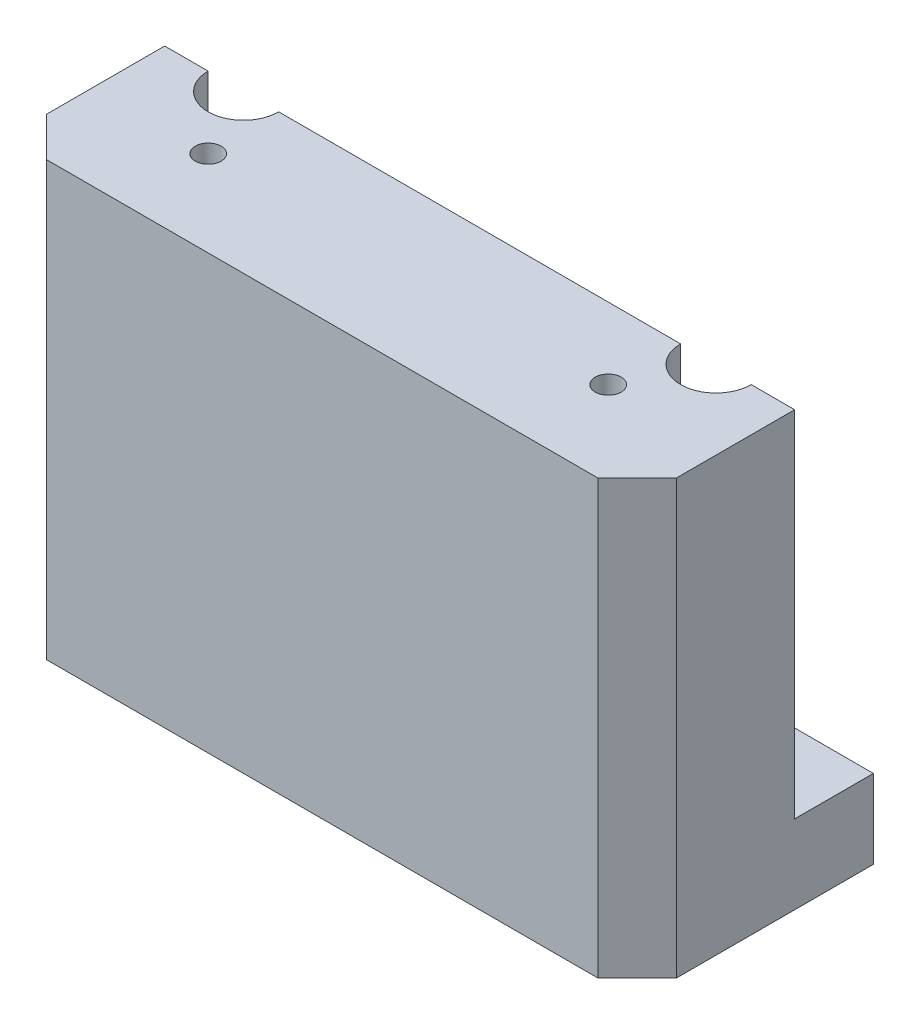
ISO-10303-21;
HEADER;
FILE_DESCRIPTION(('STEP AP214'),'2;1');
FILE_NAME('part.step','',(''),(''),'','','');
FILE_SCHEMA(('AUTOMOTIVE_DESIGN { 1 0 10303 214 1 1 1 1 }'));
ENDSEC;
DATA;
#1=APPLICATION_CONTEXT('core data for automotive mechanical design processes');
#2=APPLICATION_PROTOCOL_DEFINITION('international standard','automotive_design',2000,#1);
#3=PRODUCT_CONTEXT('',#1,'mechanical');
#4=PRODUCT('Part','Part','',(#3));
#5=PRODUCT_RELATED_PRODUCT_CATEGORY('part','',(#4));
#6=PRODUCT_DEFINITION_FORMATION('','',#4);
#7=PRODUCT_DEFINITION_CONTEXT('part definition',#1,'design');
#8=PRODUCT_DEFINITION('design','',#6,#7);
#9=PRODUCT_DEFINITION_SHAPE('','',#8);
#10=(LENGTH_UNIT() NAMED_UNIT(*) SI_UNIT(.MILLI.,.METRE.));
#11=(NAMED_UNIT(*) PLANE_ANGLE_UNIT() SI_UNIT($,.RADIAN.));
#12=(NAMED_UNIT(*) SI_UNIT($,.STERADIAN.) SOLID_ANGLE_UNIT());
#13=UNCERTAINTY_MEASURE_WITH_UNIT(LENGTH_MEASURE(1.E-05),#10,'distance_accuracy_value','');
#14=(GEOMETRIC_REPRESENTATION_CONTEXT(3) GLOBAL_UNCERTAINTY_ASSIGNED_CONTEXT((#13)) GLOBAL_UNIT_ASSIGNED_CONTEXT((#10,
#11,#12)) REPRESENTATION_CONTEXT('',''));
#15=CARTESIAN_POINT('',(0.,0.,0.));
#16=DIRECTION('',(0.,0.,1.));
#17=DIRECTION('',(1.,0.,0.));
#18=AXIS2_PLACEMENT_3D('',#15,#16,#17);
#19=CARTESIAN_POINT('',(0.,55.,0.));
#20=DIRECTION('',(0.,-1.,0.));
#21=DIRECTION('',(0.,0.,-1.));
#22=AXIS2_PLACEMENT_3D('',#19,#20,#21);
#23=PLANE('',#22);
#24=CARTESIAN_POINT('',(25.4,55.,4.078));
#25=DIRECTION('',(0.,1.,0.));
#26=DIRECTION('',(0.,0.,1.));
#27=AXIS2_PLACEMENT_3D('',#24,#25,#26);
#28=CIRCLE('',#27,1.64999999999999);
#29=CARTESIAN_POINT('',(25.4,55.,5.72799999999999));
#30=VERTEX_POINT('',#29);
#31=EDGE_CURVE('E250',#30,#30,#28,.T.);
#32=ORIENTED_EDGE('',*,*,#31,.F.);
#33=EDGE_LOOP('',(#32));
#34=FACE_BOUND('',#33,.T.);
#35=CARTESIAN_POINT('',(-25.4,55.,4.078));
#36=DIRECTION('',(0.,1.,0.));
#37=DIRECTION('',(0.,0.,1.));
#38=AXIS2_PLACEMENT_3D('',#35,#36,#37);
#39=CIRCLE('',#38,1.64999999999999);
#40=CARTESIAN_POINT('',(-25.4,55.,5.72799999999999));
#41=VERTEX_POINT('',#40);
#42=EDGE_CURVE('E316',#41,#41,#39,.T.);
#43=ORIENTED_EDGE('',*,*,#42,.F.);
#44=EDGE_LOOP('',(#43));
#45=FACE_BOUND('',#44,.T.);
#46=DIRECTION('',(-1.,0.,0.));
#47=VECTOR('',#46,1.);
#48=CARTESIAN_POINT('',(40.,55.,-5.));
#49=LINE('',#48,#47);
#50=CARTESIAN_POINT('',(-34.48,55.,-5.));
#51=VERTEX_POINT('',#50);
#52=CARTESIAN_POINT('',(-40.,55.,-5.));
#53=VERTEX_POINT('',#52);
#54=EDGE_CURVE('E147',#51,#53,#49,.T.);
#55=ORIENTED_EDGE('',*,*,#54,.T.);
#56=DIRECTION('',(0.,0.,1.));
#57=VECTOR('',#56,1.);
#58=CARTESIAN_POINT('',(-40.,55.,15.));
#59=LINE('',#58,#57);
#60=CARTESIAN_POINT('',(-40.,55.,9.99999999999997));
#61=VERTEX_POINT('',#60);
#62=EDGE_CURVE('E159',#53,#61,#59,.T.);
#63=ORIENTED_EDGE('',*,*,#62,.T.);
#64=DIRECTION('',(-0.707106781186546,0.,-0.707106781186549));
#65=VECTOR('',#64,1.);
#66=CARTESIAN_POINT('',(-35.,55.,15.));
#67=LINE('',#66,#65);
#68=CARTESIAN_POINT('',(-35.,55.,15.));
#69=VERTEX_POINT('',#68);
#70=EDGE_CURVE('E222',#61,#69,#67,.F.);
#71=ORIENTED_EDGE('',*,*,#70,.T.);
#72=DIRECTION('',(1.,0.,0.));
#73=VECTOR('',#72,1.);
#74=CARTESIAN_POINT('',(-40.,55.,15.));
#75=LINE('',#74,#73);
#76=CARTESIAN_POINT('',(35.,55.,15.));
#77=VERTEX_POINT('',#76);
#78=EDGE_CURVE('E174',#69,#77,#75,.T.);
#79=ORIENTED_EDGE('',*,*,#78,.T.);
#80=DIRECTION('',(-0.707106781186549,0.,0.707106781186547));
#81=VECTOR('',#80,1.);
#82=CARTESIAN_POINT('',(40.,55.,10.));
#83=LINE('',#82,#81);
#84=CARTESIAN_POINT('',(40.,55.,10.));
#85=VERTEX_POINT('',#84);
#86=EDGE_CURVE('E72',#77,#85,#83,.F.);
#87=ORIENTED_EDGE('',*,*,#86,.T.);
#88=DIRECTION('',(0.,0.,-1.));
#89=VECTOR('',#88,1.);
#90=CARTESIAN_POINT('',(40.,55.,15.));
#91=LINE('',#90,#89);
#92=CARTESIAN_POINT('',(40.,55.,-5.));
#93=VERTEX_POINT('',#92);
#94=EDGE_CURVE('E175',#85,#93,#91,.T.);
#95=ORIENTED_EDGE('',*,*,#94,.T.);
#96=CARTESIAN_POINT('',(34.48,55.,-5.));
#97=VERTEX_POINT('',#96);
#98=EDGE_CURVE('E156',#93,#97,#49,.T.);
#99=ORIENTED_EDGE('',*,*,#98,.T.);
#100=CARTESIAN_POINT('',(30.,55.,-5.));
#101=DIRECTION('',(0.,1.,0.));
#102=DIRECTION('',(0.,0.,1.));
#103=AXIS2_PLACEMENT_3D('',#100,#101,#102);
#104=CIRCLE('',#103,4.48);
#105=CARTESIAN_POINT('',(25.52,55.,-5.));
#106=VERTEX_POINT('',#105);
#107=EDGE_CURVE('E238',#106,#97,#104,.T.);
#108=ORIENTED_EDGE('',*,*,#107,.F.);
#109=CARTESIAN_POINT('',(-25.52,55.,-5.));
#110=VERTEX_POINT('',#109);
#111=EDGE_CURVE('E165',#106,#110,#49,.T.);
#112=ORIENTED_EDGE('',*,*,#111,.T.);
#113=CARTESIAN_POINT('',(-30.,55.,-5.));
#114=DIRECTION('',(0.,1.,0.));
#115=DIRECTION('',(0.,0.,1.));
#116=AXIS2_PLACEMENT_3D('',#113,#114,#115);
#117=CIRCLE('',#116,4.48);
#118=EDGE_CURVE('E163',#51,#110,#117,.T.);
#119=ORIENTED_EDGE('',*,*,#118,.F.);
#120=EDGE_LOOP('',(#55,#63,#71,#79,#87,#95,#99,#108,#112,#119));
#121=FACE_BOUND('',#120,.T.);
#122=ADVANCED_FACE('F47',(#34,#45,#121),#23,.F.);
#123=CARTESIAN_POINT('',(30.,55.,-5.));
#124=DIRECTION('',(0.,1.,0.));
#125=DIRECTION('',(0.,0.,1.));
#126=AXIS2_PLACEMENT_3D('',#123,#124,#125);
#127=CYLINDRICAL_SURFACE('',#126,4.47999999999999);
#128=DIRECTION('',(0.,1.,0.));
#129=VECTOR('',#128,1.);
#130=CARTESIAN_POINT('',(25.52,55.,-5.));
#131=LINE('',#130,#129);
#132=CARTESIAN_POINT('',(25.52,10.,-5.));
#133=VERTEX_POINT('',#132);
#134=EDGE_CURVE('E311',#106,#133,#131,.F.);
#135=ORIENTED_EDGE('',*,*,#134,.F.);
#136=ORIENTED_EDGE('',*,*,#107,.T.);
#137=DIRECTION('',(0.,1.,0.));
#138=VECTOR('',#137,1.);
#139=CARTESIAN_POINT('',(34.48,55.,-5.));
#140=LINE('',#139,#138);
#141=CARTESIAN_POINT('',(34.48,10.,-5.));
#142=VERTEX_POINT('',#141);
#143=EDGE_CURVE('E303',#142,#97,#140,.T.);
#144=ORIENTED_EDGE('',*,*,#143,.F.);
#145=CARTESIAN_POINT('',(30.,10.,-5.));
#146=DIRECTION('',(0.,1.,0.));
#147=DIRECTION('',(0.,0.,1.));
#148=AXIS2_PLACEMENT_3D('',#145,#146,#147);
#149=CIRCLE('',#148,4.47999999999999);
#150=EDGE_CURVE('E266',#133,#142,#149,.T.);
#151=ORIENTED_EDGE('',*,*,#150,.F.);
#152=EDGE_LOOP('',(#135,#136,#144,#151));
#153=FACE_BOUND('',#152,.T.);
#154=ADVANCED_FACE('F309',(#153),#127,.F.);
#155=CARTESIAN_POINT('',(-30.,55.,-5.));
#156=DIRECTION('',(0.,1.,0.));
#157=DIRECTION('',(0.,0.,1.));
#158=AXIS2_PLACEMENT_3D('',#155,#156,#157);
#159=CYLINDRICAL_SURFACE('',#158,4.47999999999999);
#160=DIRECTION('',(0.,1.,0.));
#161=VECTOR('',#160,1.);
#162=CARTESIAN_POINT('',(-34.48,55.,-5.));
#163=LINE('',#162,#161);
#164=CARTESIAN_POINT('',(-34.48,10.,-5.));
#165=VERTEX_POINT('',#164);
#166=EDGE_CURVE('E11',#51,#165,#163,.F.);
#167=ORIENTED_EDGE('',*,*,#166,.F.);
#168=ORIENTED_EDGE('',*,*,#118,.T.);
#169=DIRECTION('',(0.,1.,0.));
#170=VECTOR('',#169,1.);
#171=CARTESIAN_POINT('',(-25.52,55.,-5.));
#172=LINE('',#171,#170);
#173=CARTESIAN_POINT('',(-25.52,10.,-5.));
#174=VERTEX_POINT('',#173);
#175=EDGE_CURVE('E57',#174,#110,#172,.T.);
#176=ORIENTED_EDGE('',*,*,#175,.F.);
#177=CARTESIAN_POINT('',(-30.,10.,-5.));
#178=DIRECTION('',(0.,1.,0.));
#179=DIRECTION('',(0.,0.,1.));
#180=AXIS2_PLACEMENT_3D('',#177,#178,#179);
#181=CIRCLE('',#180,4.47999999999999);
#182=EDGE_CURVE('E242',#165,#174,#181,.T.);
#183=ORIENTED_EDGE('',*,*,#182,.F.);
#184=EDGE_LOOP('',(#167,#168,#176,#183));
#185=FACE_BOUND('',#184,.T.);
#186=ADVANCED_FACE('F240',(#185),#159,.F.);
#187=CARTESIAN_POINT('',(40.,55.,15.));
#188=DIRECTION('',(-1.,0.,0.));
#189=DIRECTION('',(0.,0.,1.));
#190=AXIS2_PLACEMENT_3D('',#187,#188,#189);
#191=PLANE('',#190);
#192=DIRECTION('',(0.,-1.,0.));
#193=VECTOR('',#192,1.);
#194=CARTESIAN_POINT('',(40.,55.,-15.));
#195=LINE('',#194,#193);
#196=CARTESIAN_POINT('',(40.,10.,-15.));
#197=VERTEX_POINT('',#196);
#198=CARTESIAN_POINT('',(40.,0.,-15.));
#199=VERTEX_POINT('',#198);
#200=EDGE_CURVE('E202',#197,#199,#195,.T.);
#201=ORIENTED_EDGE('',*,*,#200,.F.);
#202=DIRECTION('',(0.,0.,-1.));
#203=VECTOR('',#202,1.);
#204=CARTESIAN_POINT('',(40.,10.,-5.));
#205=LINE('',#204,#203);
#206=CARTESIAN_POINT('',(40.,10.,-5.));
#207=VERTEX_POINT('',#206);
#208=EDGE_CURVE('E318',#207,#197,#205,.T.);
#209=ORIENTED_EDGE('',*,*,#208,.F.);
#210=DIRECTION('',(0.,1.,0.));
#211=VECTOR('',#210,1.);
#212=CARTESIAN_POINT('',(40.,10.,-5.));
#213=LINE('',#212,#211);
#214=EDGE_CURVE('E305',#207,#93,#213,.T.);
#215=ORIENTED_EDGE('',*,*,#214,.T.);
#216=ORIENTED_EDGE('',*,*,#94,.F.);
#217=DIRECTION('',(0.,-1.,0.));
#218=VECTOR('',#217,1.);
#219=CARTESIAN_POINT('',(40.,55.,10.));
#220=LINE('',#219,#218);
#221=CARTESIAN_POINT('',(40.,0.,10.));
#222=VERTEX_POINT('',#221);
#223=EDGE_CURVE('E225',#85,#222,#220,.T.);
#224=ORIENTED_EDGE('',*,*,#223,.T.);
#225=DIRECTION('',(0.,0.,-1.));
#226=VECTOR('',#225,1.);
#227=CARTESIAN_POINT('',(40.,0.,15.));
#228=LINE('',#227,#226);
#229=EDGE_CURVE('E185',#222,#199,#228,.T.);
#230=ORIENTED_EDGE('',*,*,#229,.T.);
#231=EDGE_LOOP('',(#201,#209,#215,#216,#224,#230));
#232=FACE_BOUND('',#231,.T.);
#233=ADVANCED_FACE('F366',(#232),#191,.F.);
#234=CARTESIAN_POINT('',(-40.,55.,-15.));
#235=DIRECTION('',(0.,0.,1.));
#236=DIRECTION('',(1.,0.,0.));
#237=AXIS2_PLACEMENT_3D('',#234,#235,#236);
#238=PLANE('',#237);
#239=DIRECTION('',(0.,-1.,0.));
#240=VECTOR('',#239,1.);
#241=CARTESIAN_POINT('',(-40.,55.,-15.));
#242=LINE('',#241,#240);
#243=CARTESIAN_POINT('',(-40.,10.,-15.));
#244=VERTEX_POINT('',#243);
#245=CARTESIAN_POINT('',(-40.,0.,-15.));
#246=VERTEX_POINT('',#245);
#247=EDGE_CURVE('E179',#244,#246,#242,.T.);
#248=ORIENTED_EDGE('',*,*,#247,.F.);
#249=DIRECTION('',(-1.,0.,0.));
#250=VECTOR('',#249,1.);
#251=CARTESIAN_POINT('',(40.,10.,-15.));
#252=LINE('',#251,#250);
#253=EDGE_CURVE('E166',#197,#244,#252,.T.);
#254=ORIENTED_EDGE('',*,*,#253,.F.);
#255=ORIENTED_EDGE('',*,*,#200,.T.);
#256=DIRECTION('',(-1.,0.,0.));
#257=VECTOR('',#256,1.);
#258=CARTESIAN_POINT('',(-40.,0.,-15.));
#259=LINE('',#258,#257);
#260=EDGE_CURVE('E189',#199,#246,#259,.T.);
#261=ORIENTED_EDGE('',*,*,#260,.T.);
#262=EDGE_LOOP('',(#248,#254,#255,#261));
#263=FACE_BOUND('',#262,.T.);
#264=ADVANCED_FACE('F384',(#263),#238,.F.);
#265=CARTESIAN_POINT('',(-40.,55.,15.));
#266=DIRECTION('',(1.,0.,0.));
#267=DIRECTION('',(0.,0.,-1.));
#268=AXIS2_PLACEMENT_3D('',#265,#266,#267);
#269=PLANE('',#268);
#270=DIRECTION('',(0.,1.,0.));
#271=VECTOR('',#270,1.);
#272=CARTESIAN_POINT('',(-40.,10.,-5.));
#273=LINE('',#272,#271);
#274=CARTESIAN_POINT('',(-40.,10.,-5.));
#275=VERTEX_POINT('',#274);
#276=EDGE_CURVE('E144',#275,#53,#273,.T.);
#277=ORIENTED_EDGE('',*,*,#276,.F.);
#278=DIRECTION('',(0.,0.,-1.));
#279=VECTOR('',#278,1.);
#280=CARTESIAN_POINT('',(-40.,10.,-5.));
#281=LINE('',#280,#279);
#282=EDGE_CURVE('E312',#275,#244,#281,.T.);
#283=ORIENTED_EDGE('',*,*,#282,.T.);
#284=ORIENTED_EDGE('',*,*,#247,.T.);
#285=DIRECTION('',(0.,0.,1.));
#286=VECTOR('',#285,1.);
#287=CARTESIAN_POINT('',(-40.,0.,15.));
#288=LINE('',#287,#286);
#289=CARTESIAN_POINT('',(-40.,0.,9.99999999999997));
#290=VERTEX_POINT('',#289);
#291=EDGE_CURVE('E194',#246,#290,#288,.T.);
#292=ORIENTED_EDGE('',*,*,#291,.T.);
#293=DIRECTION('',(0.,1.,0.));
#294=VECTOR('',#293,1.);
#295=CARTESIAN_POINT('',(-40.,55.,9.99999999999997));
#296=LINE('',#295,#294);
#297=EDGE_CURVE('E171',#290,#61,#296,.T.);
#298=ORIENTED_EDGE('',*,*,#297,.T.);
#299=ORIENTED_EDGE('',*,*,#62,.F.);
#300=EDGE_LOOP('',(#277,#283,#284,#292,#298,#299));
#301=FACE_BOUND('',#300,.T.);
#302=ADVANCED_FACE('F168',(#301),#269,.F.);
#303=CARTESIAN_POINT('',(-40.,55.,15.));
#304=DIRECTION('',(0.,0.,-1.));
#305=DIRECTION('',(-1.,0.,0.));
#306=AXIS2_PLACEMENT_3D('',#303,#304,#305);
#307=PLANE('',#306);
#308=ORIENTED_EDGE('',*,*,#78,.F.);
#309=DIRECTION('',(0.,-1.,0.));
#310=VECTOR('',#309,1.);
#311=CARTESIAN_POINT('',(-35.,55.,15.));
#312=LINE('',#311,#310);
#313=CARTESIAN_POINT('',(-35.,0.,15.));
#314=VERTEX_POINT('',#313);
#315=EDGE_CURVE('E208',#69,#314,#312,.T.);
#316=ORIENTED_EDGE('',*,*,#315,.T.);
#317=DIRECTION('',(1.,0.,0.));
#318=VECTOR('',#317,1.);
#319=CARTESIAN_POINT('',(-40.,0.,15.));
#320=LINE('',#319,#318);
#321=CARTESIAN_POINT('',(35.,0.,15.));
#322=VERTEX_POINT('',#321);
#323=EDGE_CURVE('E181',#314,#322,#320,.T.);
#324=ORIENTED_EDGE('',*,*,#323,.T.);
#325=DIRECTION('',(0.,1.,0.));
#326=VECTOR('',#325,1.);
#327=CARTESIAN_POINT('',(35.,55.,15.));
#328=LINE('',#327,#326);
#329=EDGE_CURVE('E205',#322,#77,#328,.T.);
#330=ORIENTED_EDGE('',*,*,#329,.T.);
#331=EDGE_LOOP('',(#308,#316,#324,#330));
#332=FACE_BOUND('',#331,.T.);
#333=ADVANCED_FACE('F377',(#332),#307,.F.);
#334=CARTESIAN_POINT('',(0.,0.,0.));
#335=DIRECTION('',(0.,-1.,0.));
#336=DIRECTION('',(0.,0.,-1.));
#337=AXIS2_PLACEMENT_3D('',#334,#335,#336);
#338=PLANE('',#337);
#339=CARTESIAN_POINT('',(-30.,0.,-5.));
#340=DIRECTION('',(0.,1.,0.));
#341=DIRECTION('',(0.,0.,1.));
#342=AXIS2_PLACEMENT_3D('',#339,#340,#341);
#343=CIRCLE('',#342,2.24999999999998);
#344=CARTESIAN_POINT('',(-30.,0.,-2.75000000000001));
#345=VERTEX_POINT('',#344);
#346=EDGE_CURVE('E260',#345,#345,#343,.T.);
#347=ORIENTED_EDGE('',*,*,#346,.T.);
#348=EDGE_LOOP('',(#347));
#349=FACE_BOUND('',#348,.T.);
#350=CARTESIAN_POINT('',(30.,0.,-5.));
#351=DIRECTION('',(0.,1.,0.));
#352=DIRECTION('',(0.,0.,1.));
#353=AXIS2_PLACEMENT_3D('',#350,#351,#352);
#354=CIRCLE('',#353,2.24999999999999);
#355=CARTESIAN_POINT('',(30.,0.,-2.75000000000001));
#356=VERTEX_POINT('',#355);
#357=EDGE_CURVE('E190',#356,#356,#354,.T.);
#358=ORIENTED_EDGE('',*,*,#357,.T.);
#359=EDGE_LOOP('',(#358));
#360=FACE_BOUND('',#359,.T.);
#361=ORIENTED_EDGE('',*,*,#323,.F.);
#362=DIRECTION('',(0.707106781186546,0.,0.707106781186549));
#363=VECTOR('',#362,1.);
#364=CARTESIAN_POINT('',(-25.0000000000001,0.,25.));
#365=LINE('',#364,#363);
#366=EDGE_CURVE('E215',#314,#290,#365,.F.);
#367=ORIENTED_EDGE('',*,*,#366,.T.);
#368=ORIENTED_EDGE('',*,*,#291,.F.);
#369=ORIENTED_EDGE('',*,*,#260,.F.);
#370=ORIENTED_EDGE('',*,*,#229,.F.);
#371=DIRECTION('',(0.707106781186549,0.,-0.707106781186547));
#372=VECTOR('',#371,1.);
#373=CARTESIAN_POINT('',(24.9999999999999,0.,25.));
#374=LINE('',#373,#372);
#375=EDGE_CURVE('E212',#222,#322,#374,.F.);
#376=ORIENTED_EDGE('',*,*,#375,.T.);
#377=EDGE_LOOP('',(#361,#367,#368,#369,#370,#376));
#378=FACE_BOUND('',#377,.T.);
#379=ADVANCED_FACE('F278',(#349,#360,#378),#338,.T.);
#380=CARTESIAN_POINT('',(30.,55.,-5.));
#381=DIRECTION('',(0.,1.,0.));
#382=DIRECTION('',(0.,0.,1.));
#383=AXIS2_PLACEMENT_3D('',#380,#381,#382);
#384=CYLINDRICAL_SURFACE('',#383,2.24999999999999);
#385=ORIENTED_EDGE('',*,*,#357,.F.);
#386=EDGE_LOOP('',(#385));
#387=FACE_BOUND('',#386,.T.);
#388=CARTESIAN_POINT('',(30.,7.77000000000001,-5.));
#389=DIRECTION('',(0.,1.,0.));
#390=DIRECTION('',(0.,0.,1.));
#391=AXIS2_PLACEMENT_3D('',#388,#389,#390);
#392=CIRCLE('',#391,2.24999999999999);
#393=CARTESIAN_POINT('',(30.,7.77000000000001,-2.75000000000001));
#394=VERTEX_POINT('',#393);
#395=EDGE_CURVE('E271',#394,#394,#392,.T.);
#396=ORIENTED_EDGE('',*,*,#395,.T.);
#397=EDGE_LOOP('',(#396));
#398=FACE_BOUND('',#397,.T.);
#399=ADVANCED_FACE('F281',(#387,#398),#384,.F.);
#400=CARTESIAN_POINT('',(30.,10.,-5.));
#401=DIRECTION('',(0.,1.,0.));
#402=DIRECTION('',(0.,0.,1.));
#403=AXIS2_PLACEMENT_3D('',#400,#401,#402);
#404=CONICAL_SURFACE('',#403,4.47999999999999,0.78539816339745);
#405=ORIENTED_EDGE('',*,*,#395,.F.);
#406=EDGE_LOOP('',(#405));
#407=FACE_BOUND('',#406,.T.);
#408=EDGE_CURVE('E267',#142,#133,#149,.T.);
#409=ORIENTED_EDGE('',*,*,#408,.T.);
#410=ORIENTED_EDGE('',*,*,#150,.T.);
#411=EDGE_LOOP('',(#409,#410));
#412=FACE_BOUND('',#411,.T.);
#413=ADVANCED_FACE('F284',(#407,#412),#404,.F.);
#414=CARTESIAN_POINT('',(-30.,55.,-5.));
#415=DIRECTION('',(0.,1.,0.));
#416=DIRECTION('',(0.,0.,1.));
#417=AXIS2_PLACEMENT_3D('',#414,#415,#416);
#418=CYLINDRICAL_SURFACE('',#417,2.24999999999999);
#419=ORIENTED_EDGE('',*,*,#346,.F.);
#420=EDGE_LOOP('',(#419));
#421=FACE_BOUND('',#420,.T.);
#422=CARTESIAN_POINT('',(-30.,7.77000000000001,-5.));
#423=DIRECTION('',(0.,1.,0.));
#424=DIRECTION('',(0.,0.,1.));
#425=AXIS2_PLACEMENT_3D('',#422,#423,#424);
#426=CIRCLE('',#425,2.24999999999999);
#427=CARTESIAN_POINT('',(-30.,7.77000000000001,-2.75000000000001));
#428=VERTEX_POINT('',#427);
#429=EDGE_CURVE('E256',#428,#428,#426,.T.);
#430=ORIENTED_EDGE('',*,*,#429,.T.);
#431=EDGE_LOOP('',(#430));
#432=FACE_BOUND('',#431,.T.);
#433=ADVANCED_FACE('F290',(#421,#432),#418,.F.);
#434=CARTESIAN_POINT('',(-30.,10.,-5.));
#435=DIRECTION('',(0.,1.,0.));
#436=DIRECTION('',(0.,0.,1.));
#437=AXIS2_PLACEMENT_3D('',#434,#435,#436);
#438=CONICAL_SURFACE('',#437,4.47999999999999,0.78539816339745);
#439=ORIENTED_EDGE('',*,*,#429,.F.);
#440=EDGE_LOOP('',(#439));
#441=FACE_BOUND('',#440,.T.);
#442=EDGE_CURVE('E247',#174,#165,#181,.T.);
#443=ORIENTED_EDGE('',*,*,#442,.T.);
#444=ORIENTED_EDGE('',*,*,#182,.T.);
#445=EDGE_LOOP('',(#443,#444));
#446=FACE_BOUND('',#445,.T.);
#447=ADVANCED_FACE('F362',(#441,#446),#438,.F.);
#448=CARTESIAN_POINT('',(25.4,35.,4.078));
#449=DIRECTION('',(0.,1.,0.));
#450=DIRECTION('',(0.,0.,1.));
#451=AXIS2_PLACEMENT_3D('',#448,#449,#450);
#452=CONICAL_SURFACE('',#451,1.65,1.02974425867665);
#453=CARTESIAN_POINT('',(25.4,34.0085799786045,4.078));
#454=VERTEX_POINT('',#453);
#455=VERTEX_LOOP('',#454);
#456=FACE_BOUND('',#455,.T.);
#457=CARTESIAN_POINT('',(25.4,35.,4.078));
#458=DIRECTION('',(0.,1.,0.));
#459=DIRECTION('',(0.,0.,1.));
#460=AXIS2_PLACEMENT_3D('',#457,#458,#459);
#461=CIRCLE('',#460,1.65);
#462=CARTESIAN_POINT('',(25.4,35.,5.728));
#463=VERTEX_POINT('',#462);
#464=EDGE_CURVE('E243',#463,#463,#461,.T.);
#465=ORIENTED_EDGE('',*,*,#464,.T.);
#466=EDGE_LOOP('',(#465));
#467=FACE_BOUND('',#466,.T.);
#468=ADVANCED_FACE('F358',(#456,#467),#452,.F.);
#469=CARTESIAN_POINT('',(25.4,55.,4.078));
#470=DIRECTION('',(0.,1.,0.));
#471=DIRECTION('',(0.,0.,1.));
#472=AXIS2_PLACEMENT_3D('',#469,#470,#471);
#473=CYLINDRICAL_SURFACE('',#472,1.64999999999999);
#474=ORIENTED_EDGE('',*,*,#464,.F.);
#475=EDGE_LOOP('',(#474));
#476=FACE_BOUND('',#475,.T.);
#477=ORIENTED_EDGE('',*,*,#31,.T.);
#478=EDGE_LOOP('',(#477));
#479=FACE_BOUND('',#478,.T.);
#480=ADVANCED_FACE('F332',(#476,#479),#473,.F.);
#481=CARTESIAN_POINT('',(-25.4,35.,4.078));
#482=DIRECTION('',(0.,1.,0.));
#483=DIRECTION('',(0.,0.,1.));
#484=AXIS2_PLACEMENT_3D('',#481,#482,#483);
#485=CONICAL_SURFACE('',#484,1.65,1.02974425867665);
#486=CARTESIAN_POINT('',(-25.4,34.0085799786045,4.078));
#487=VERTEX_POINT('',#486);
#488=VERTEX_LOOP('',#487);
#489=FACE_BOUND('',#488,.T.);
#490=CARTESIAN_POINT('',(-25.4,35.,4.078));
#491=DIRECTION('',(0.,1.,0.));
#492=DIRECTION('',(0.,0.,1.));
#493=AXIS2_PLACEMENT_3D('',#490,#491,#492);
#494=CIRCLE('',#493,1.65);
#495=CARTESIAN_POINT('',(-25.4,35.,5.728));
#496=VERTEX_POINT('',#495);
#497=EDGE_CURVE('E325',#496,#496,#494,.T.);
#498=ORIENTED_EDGE('',*,*,#497,.T.);
#499=EDGE_LOOP('',(#498));
#500=FACE_BOUND('',#499,.T.);
#501=ADVANCED_FACE('F342',(#489,#500),#485,.F.);
#502=CARTESIAN_POINT('',(-25.4,55.,4.078));
#503=DIRECTION('',(0.,1.,0.));
#504=DIRECTION('',(0.,0.,1.));
#505=AXIS2_PLACEMENT_3D('',#502,#503,#504);
#506=CYLINDRICAL_SURFACE('',#505,1.64999999999999);
#507=ORIENTED_EDGE('',*,*,#497,.F.);
#508=EDGE_LOOP('',(#507));
#509=FACE_BOUND('',#508,.T.);
#510=ORIENTED_EDGE('',*,*,#42,.T.);
#511=EDGE_LOOP('',(#510));
#512=FACE_BOUND('',#511,.T.);
#513=ADVANCED_FACE('F339',(#509,#512),#506,.F.);
#514=CARTESIAN_POINT('',(-35.,55.,15.));
#515=DIRECTION('',(0.707106781186549,0.,-0.707106781186545));
#516=DIRECTION('',(0.,-1.,0.));
#517=AXIS2_PLACEMENT_3D('',#514,#515,#516);
#518=PLANE('',#517);
#519=ORIENTED_EDGE('',*,*,#70,.F.);
#520=ORIENTED_EDGE('',*,*,#297,.F.);
#521=ORIENTED_EDGE('',*,*,#366,.F.);
#522=ORIENTED_EDGE('',*,*,#315,.F.);
#523=EDGE_LOOP('',(#519,#520,#521,#522));
#524=FACE_BOUND('',#523,.T.);
#525=ADVANCED_FACE('F341',(#524),#518,.F.);
#526=CARTESIAN_POINT('',(40.,55.,10.));
#527=DIRECTION('',(-0.707106781186547,0.,-0.707106781186549));
#528=DIRECTION('',(0.,-1.,0.));
#529=AXIS2_PLACEMENT_3D('',#526,#527,#528);
#530=PLANE('',#529);
#531=ORIENTED_EDGE('',*,*,#86,.F.);
#532=ORIENTED_EDGE('',*,*,#329,.F.);
#533=ORIENTED_EDGE('',*,*,#375,.F.);
#534=ORIENTED_EDGE('',*,*,#223,.F.);
#535=EDGE_LOOP('',(#531,#532,#533,#534));
#536=FACE_BOUND('',#535,.T.);
#537=ADVANCED_FACE('F50',(#536),#530,.F.);
#538=CARTESIAN_POINT('',(40.,10.,-5.));
#539=DIRECTION('',(0.,-1.,0.));
#540=DIRECTION('',(1.,0.,0.));
#541=AXIS2_PLACEMENT_3D('',#538,#539,#540);
#542=PLANE('',#541);
#543=DIRECTION('',(-1.,0.,0.));
#544=VECTOR('',#543,1.);
#545=CARTESIAN_POINT('',(40.,10.,-5.));
#546=LINE('',#545,#544);
#547=EDGE_CURVE('E298',#207,#142,#546,.T.);
#548=ORIENTED_EDGE('',*,*,#547,.F.);
#549=ORIENTED_EDGE('',*,*,#208,.T.);
#550=ORIENTED_EDGE('',*,*,#253,.T.);
#551=ORIENTED_EDGE('',*,*,#282,.F.);
#552=EDGE_CURVE('E150',#165,#275,#546,.T.);
#553=ORIENTED_EDGE('',*,*,#552,.F.);
#554=ORIENTED_EDGE('',*,*,#442,.F.);
#555=EDGE_CURVE('E64',#133,#174,#546,.T.);
#556=ORIENTED_EDGE('',*,*,#555,.F.);
#557=ORIENTED_EDGE('',*,*,#408,.F.);
#558=EDGE_LOOP('',(#548,#549,#550,#551,#553,#554,#556,#557));
#559=FACE_BOUND('',#558,.T.);
#560=ADVANCED_FACE('F297',(#559),#542,.F.);
#561=CARTESIAN_POINT('',(0.,0.,-5.));
#562=DIRECTION('',(0.,0.,-1.));
#563=DIRECTION('',(-1.,0.,0.));
#564=AXIS2_PLACEMENT_3D('',#561,#562,#563);
#565=PLANE('',#564);
#566=ORIENTED_EDGE('',*,*,#134,.T.);
#567=ORIENTED_EDGE('',*,*,#555,.T.);
#568=ORIENTED_EDGE('',*,*,#175,.T.);
#569=ORIENTED_EDGE('',*,*,#111,.F.);
#570=EDGE_LOOP('',(#566,#567,#568,#569));
#571=FACE_BOUND('',#570,.T.);
#572=ADVANCED_FACE('F230',(#571),#565,.T.);
#573=ORIENTED_EDGE('',*,*,#143,.T.);
#574=ORIENTED_EDGE('',*,*,#98,.F.);
#575=ORIENTED_EDGE('',*,*,#214,.F.);
#576=ORIENTED_EDGE('',*,*,#547,.T.);
#577=EDGE_LOOP('',(#573,#574,#575,#576));
#578=FACE_BOUND('',#577,.T.);
#579=ADVANCED_FACE('F302',(#578),#565,.T.);
#580=ORIENTED_EDGE('',*,*,#166,.T.);
#581=ORIENTED_EDGE('',*,*,#552,.T.);
#582=ORIENTED_EDGE('',*,*,#276,.T.);
#583=ORIENTED_EDGE('',*,*,#54,.F.);
#584=EDGE_LOOP('',(#580,#581,#582,#583));
#585=FACE_BOUND('',#584,.T.);
#586=ADVANCED_FACE('F146',(#585),#565,.T.);
#587=CLOSED_SHELL('',(#122,#154,#186,#233,#264,#302,#333,#379,#399,#413,#433,#447,#468,#480,
#501,#513,#525,#537,#560,#572,#579,#586));
#588=MANIFOLD_SOLID_BREP('B2',#587);
#589=ADVANCED_BREP_SHAPE_REPRESENTATION('',(#18,#588),#14);
#590=SHAPE_DEFINITION_REPRESENTATION(#9,#589);
ENDSEC;
END-ISO-10303-21;
